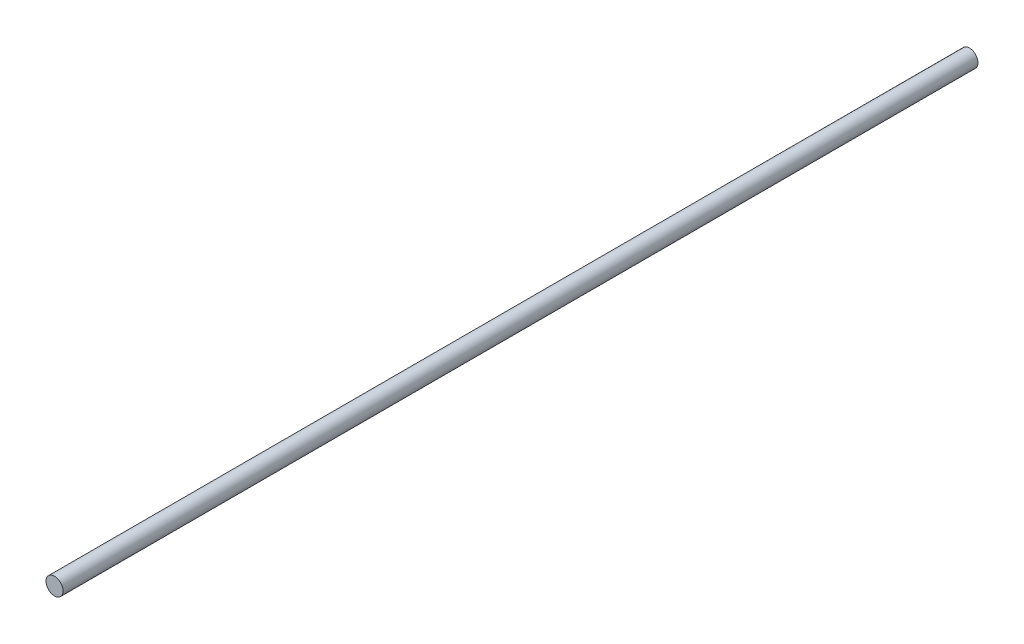
ISO-10303-21;
HEADER;
FILE_DESCRIPTION(('STEP AP214'),'2;1');
FILE_NAME('part.step','',(''),(''),'','','');
FILE_SCHEMA(('AUTOMOTIVE_DESIGN { 1 0 10303 214 1 1 1 1 }'));
ENDSEC;
DATA;
#1=APPLICATION_CONTEXT('core data for automotive mechanical design processes');
#2=APPLICATION_PROTOCOL_DEFINITION('international standard','automotive_design',2000,#1);
#3=PRODUCT_CONTEXT('',#1,'mechanical');
#4=PRODUCT('Part','Part','',(#3));
#5=PRODUCT_RELATED_PRODUCT_CATEGORY('part','',(#4));
#6=PRODUCT_DEFINITION_FORMATION('','',#4);
#7=PRODUCT_DEFINITION_CONTEXT('part definition',#1,'design');
#8=PRODUCT_DEFINITION('design','',#6,#7);
#9=PRODUCT_DEFINITION_SHAPE('','',#8);
#10=(LENGTH_UNIT() NAMED_UNIT(*) SI_UNIT(.MILLI.,.METRE.));
#11=(NAMED_UNIT(*) PLANE_ANGLE_UNIT() SI_UNIT($,.RADIAN.));
#12=(NAMED_UNIT(*) SI_UNIT($,.STERADIAN.) SOLID_ANGLE_UNIT());
#13=UNCERTAINTY_MEASURE_WITH_UNIT(LENGTH_MEASURE(1.E-05),#10,'distance_accuracy_value','');
#14=(GEOMETRIC_REPRESENTATION_CONTEXT(3) GLOBAL_UNCERTAINTY_ASSIGNED_CONTEXT((#13)) GLOBAL_UNIT_ASSIGNED_CONTEXT((#10,
#11,#12)) REPRESENTATION_CONTEXT('',''));
#15=CARTESIAN_POINT('',(0.,0.,0.));
#16=DIRECTION('',(0.,0.,1.));
#17=DIRECTION('',(1.,0.,0.));
#18=AXIS2_PLACEMENT_3D('',#15,#16,#17);
#19=CARTESIAN_POINT('',(0.,0.,214.));
#20=DIRECTION('',(0.,0.,-1.));
#21=DIRECTION('',(-1.,0.,0.));
#22=AXIS2_PLACEMENT_3D('',#19,#20,#21);
#23=CYLINDRICAL_SURFACE('',#22,2.);
#24=CARTESIAN_POINT('',(0.,0.,214.));
#25=DIRECTION('',(0.,0.,1.));
#26=DIRECTION('',(1.,0.,0.));
#27=AXIS2_PLACEMENT_3D('',#24,#25,#26);
#28=CIRCLE('',#27,2.);
#29=CARTESIAN_POINT('',(2.,0.,214.));
#30=VERTEX_POINT('',#29);
#31=EDGE_CURVE('E10',#30,#30,#28,.T.);
#32=ORIENTED_EDGE('',*,*,#31,.F.);
#33=EDGE_LOOP('',(#32));
#34=FACE_BOUND('',#33,.T.);
#35=CARTESIAN_POINT('',(0.,0.,0.));
#36=DIRECTION('',(0.,0.,1.));
#37=DIRECTION('',(1.,0.,0.));
#38=AXIS2_PLACEMENT_3D('',#35,#36,#37);
#39=CIRCLE('',#38,2.);
#40=CARTESIAN_POINT('',(2.,0.,0.));
#41=VERTEX_POINT('',#40);
#42=EDGE_CURVE('E40',#41,#41,#39,.T.);
#43=ORIENTED_EDGE('',*,*,#42,.T.);
#44=EDGE_LOOP('',(#43));
#45=FACE_BOUND('',#44,.T.);
#46=ADVANCED_FACE('F37',(#34,#45),#23,.T.);
#47=CARTESIAN_POINT('',(0.,0.,214.));
#48=DIRECTION('',(0.,0.,1.));
#49=DIRECTION('',(1.,0.,0.));
#50=AXIS2_PLACEMENT_3D('',#47,#48,#49);
#51=PLANE('',#50);
#52=ORIENTED_EDGE('',*,*,#31,.T.);
#53=EDGE_LOOP('',(#52));
#54=FACE_BOUND('',#53,.T.);
#55=ADVANCED_FACE('F52',(#54),#51,.T.);
#56=CARTESIAN_POINT('',(0.,0.,0.));
#57=DIRECTION('',(0.,0.,1.));
#58=DIRECTION('',(1.,0.,0.));
#59=AXIS2_PLACEMENT_3D('',#56,#57,#58);
#60=PLANE('',#59);
#61=ORIENTED_EDGE('',*,*,#42,.F.);
#62=EDGE_LOOP('',(#61));
#63=FACE_BOUND('',#62,.T.);
#64=ADVANCED_FACE('F50',(#63),#60,.F.);
#65=CLOSED_SHELL('',(#46,#55,#64));
#66=MANIFOLD_SOLID_BREP('B2',#65);
#67=ADVANCED_BREP_SHAPE_REPRESENTATION('',(#18,#66),#14);
#68=SHAPE_DEFINITION_REPRESENTATION(#9,#67);
ENDSEC;
END-ISO-10303-21;
